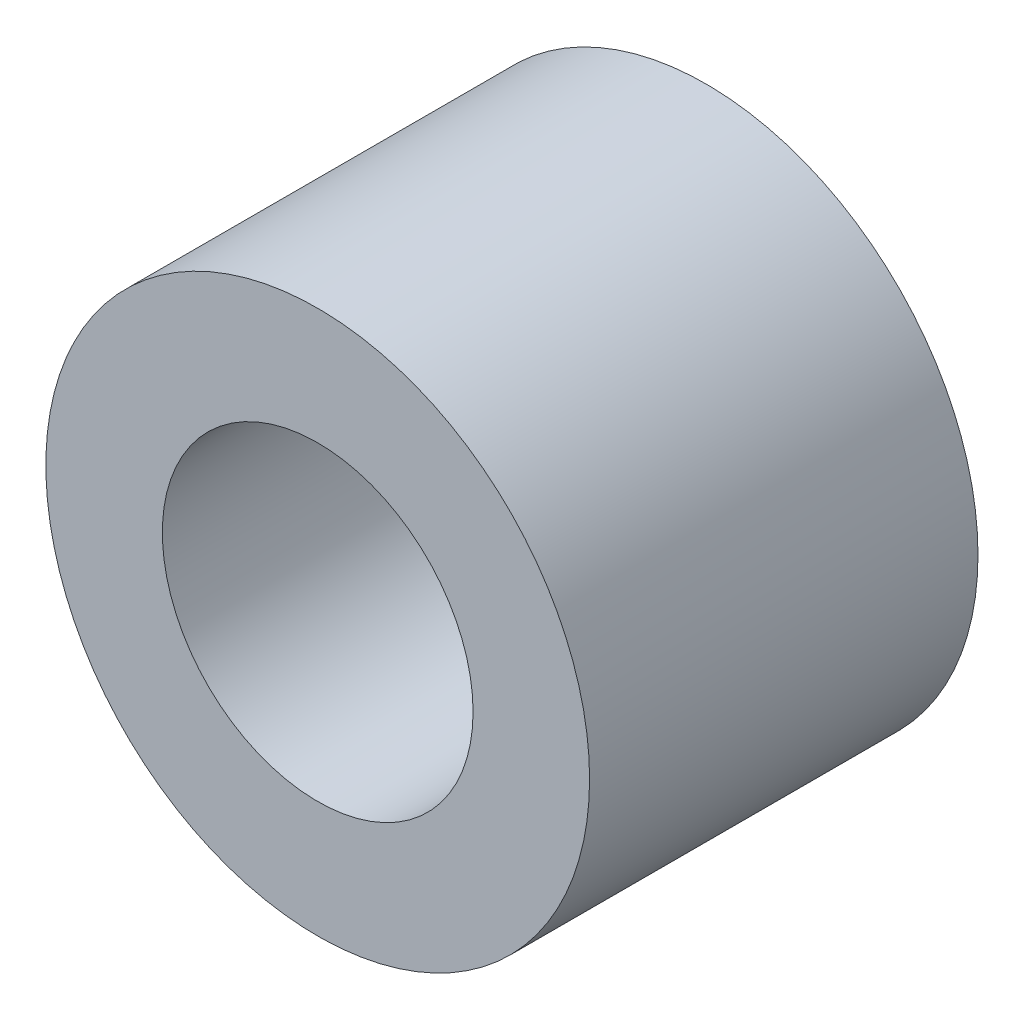
ISO-10303-21;
HEADER;
FILE_DESCRIPTION(('STEP AP214'),'2;1');
FILE_NAME('part.step','',(''),(''),'','','');
FILE_SCHEMA(('AUTOMOTIVE_DESIGN { 1 0 10303 214 1 1 1 1 }'));
ENDSEC;
DATA;
#1=APPLICATION_CONTEXT('core data for automotive mechanical design processes');
#2=APPLICATION_PROTOCOL_DEFINITION('international standard','automotive_design',2000,#1);
#3=PRODUCT_CONTEXT('',#1,'mechanical');
#4=PRODUCT('Part','Part','',(#3));
#5=PRODUCT_RELATED_PRODUCT_CATEGORY('part','',(#4));
#6=PRODUCT_DEFINITION_FORMATION('','',#4);
#7=PRODUCT_DEFINITION_CONTEXT('part definition',#1,'design');
#8=PRODUCT_DEFINITION('design','',#6,#7);
#9=PRODUCT_DEFINITION_SHAPE('','',#8);
#10=(LENGTH_UNIT() NAMED_UNIT(*) SI_UNIT(.MILLI.,.METRE.));
#11=(NAMED_UNIT(*) PLANE_ANGLE_UNIT() SI_UNIT($,.RADIAN.));
#12=(NAMED_UNIT(*) SI_UNIT($,.STERADIAN.) SOLID_ANGLE_UNIT());
#13=UNCERTAINTY_MEASURE_WITH_UNIT(LENGTH_MEASURE(1.E-05),#10,'distance_accuracy_value','');
#14=(GEOMETRIC_REPRESENTATION_CONTEXT(3) GLOBAL_UNCERTAINTY_ASSIGNED_CONTEXT((#13)) GLOBAL_UNIT_ASSIGNED_CONTEXT((#10,
#11,#12)) REPRESENTATION_CONTEXT('',''));
#15=CARTESIAN_POINT('',(0.,0.,0.));
#16=DIRECTION('',(0.,0.,1.));
#17=DIRECTION('',(1.,0.,0.));
#18=AXIS2_PLACEMENT_3D('',#15,#16,#17);
#19=CARTESIAN_POINT('',(0.,0.,10.));
#20=DIRECTION('',(0.,0.,1.));
#21=DIRECTION('',(1.,0.,0.));
#22=AXIS2_PLACEMENT_3D('',#19,#20,#21);
#23=PLANE('',#22);
#24=CARTESIAN_POINT('',(0.,0.,10.));
#25=DIRECTION('',(0.,0.,1.));
#26=DIRECTION('',(1.,0.,0.));
#27=AXIS2_PLACEMENT_3D('',#24,#25,#26);
#28=CIRCLE('',#27,7.);
#29=CARTESIAN_POINT('',(7.,0.,10.));
#30=VERTEX_POINT('',#29);
#31=EDGE_CURVE('E10',#30,#30,#28,.T.);
#32=ORIENTED_EDGE('',*,*,#31,.T.);
#33=EDGE_LOOP('',(#32));
#34=FACE_BOUND('',#33,.T.);
#35=CARTESIAN_POINT('',(0.,0.,10.));
#36=DIRECTION('',(0.,0.,1.));
#37=DIRECTION('',(1.,0.,0.));
#38=AXIS2_PLACEMENT_3D('',#35,#36,#37);
#39=CIRCLE('',#38,4.);
#40=CARTESIAN_POINT('',(4.,0.,10.));
#41=VERTEX_POINT('',#40);
#42=EDGE_CURVE('E45',#41,#41,#39,.T.);
#43=ORIENTED_EDGE('',*,*,#42,.F.);
#44=EDGE_LOOP('',(#43));
#45=FACE_BOUND('',#44,.T.);
#46=ADVANCED_FACE('F34',(#34,#45),#23,.T.);
#47=CARTESIAN_POINT('',(0.,0.,0.));
#48=DIRECTION('',(0.,0.,1.));
#49=DIRECTION('',(1.,0.,0.));
#50=AXIS2_PLACEMENT_3D('',#47,#48,#49);
#51=PLANE('',#50);
#52=CARTESIAN_POINT('',(0.,0.,0.));
#53=DIRECTION('',(0.,0.,1.));
#54=DIRECTION('',(1.,0.,0.));
#55=AXIS2_PLACEMENT_3D('',#52,#53,#54);
#56=CIRCLE('',#55,7.);
#57=CARTESIAN_POINT('',(7.,0.,0.));
#58=VERTEX_POINT('',#57);
#59=EDGE_CURVE('E38',#58,#58,#56,.T.);
#60=ORIENTED_EDGE('',*,*,#59,.F.);
#61=EDGE_LOOP('',(#60));
#62=FACE_BOUND('',#61,.T.);
#63=CARTESIAN_POINT('',(0.,0.,0.));
#64=DIRECTION('',(0.,0.,1.));
#65=DIRECTION('',(1.,0.,0.));
#66=AXIS2_PLACEMENT_3D('',#63,#64,#65);
#67=CIRCLE('',#66,4.);
#68=CARTESIAN_POINT('',(4.,0.,0.));
#69=VERTEX_POINT('',#68);
#70=EDGE_CURVE('E47',#69,#69,#67,.T.);
#71=ORIENTED_EDGE('',*,*,#70,.T.);
#72=EDGE_LOOP('',(#71));
#73=FACE_BOUND('',#72,.T.);
#74=ADVANCED_FACE('F57',(#62,#73),#51,.F.);
#75=CARTESIAN_POINT('',(0.,0.,10.));
#76=DIRECTION('',(0.,0.,-1.));
#77=DIRECTION('',(-1.,0.,0.));
#78=AXIS2_PLACEMENT_3D('',#75,#76,#77);
#79=CYLINDRICAL_SURFACE('',#78,7.);
#80=ORIENTED_EDGE('',*,*,#31,.F.);
#81=EDGE_LOOP('',(#80));
#82=FACE_BOUND('',#81,.T.);
#83=ORIENTED_EDGE('',*,*,#59,.T.);
#84=EDGE_LOOP('',(#83));
#85=FACE_BOUND('',#84,.T.);
#86=ADVANCED_FACE('F36',(#82,#85),#79,.T.);
#87=CARTESIAN_POINT('',(0.,0.,10.));
#88=DIRECTION('',(0.,0.,-1.));
#89=DIRECTION('',(-1.,0.,0.));
#90=AXIS2_PLACEMENT_3D('',#87,#88,#89);
#91=CYLINDRICAL_SURFACE('',#90,4.);
#92=ORIENTED_EDGE('',*,*,#42,.T.);
#93=EDGE_LOOP('',(#92));
#94=FACE_BOUND('',#93,.T.);
#95=ORIENTED_EDGE('',*,*,#70,.F.);
#96=EDGE_LOOP('',(#95));
#97=FACE_BOUND('',#96,.T.);
#98=ADVANCED_FACE('F53',(#94,#97),#91,.F.);
#99=CLOSED_SHELL('',(#46,#74,#86,#98));
#100=MANIFOLD_SOLID_BREP('B2',#99);
#101=ADVANCED_BREP_SHAPE_REPRESENTATION('',(#18,#100),#14);
#102=SHAPE_DEFINITION_REPRESENTATION(#9,#101);
ENDSEC;
END-ISO-10303-21;
